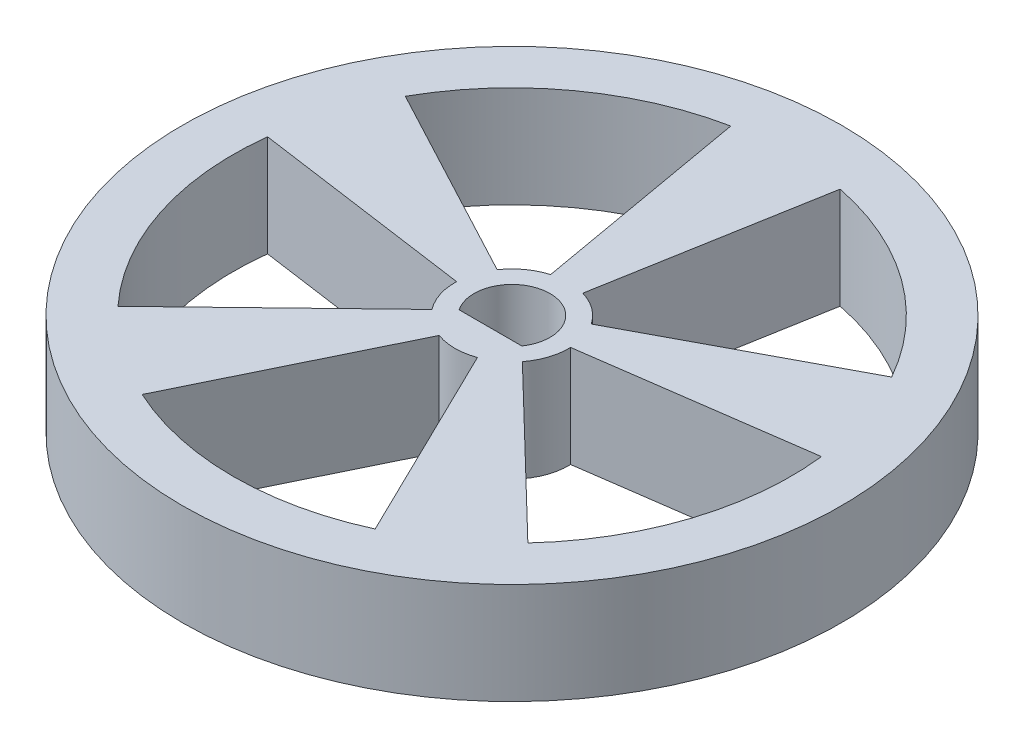
ISO-10303-21;
HEADER;
FILE_DESCRIPTION(('STEP AP214'),'2;1');
FILE_NAME('part.step','',(''),(''),'','','');
FILE_SCHEMA(('AUTOMOTIVE_DESIGN { 1 0 10303 214 1 1 1 1 }'));
ENDSEC;
DATA;
#1=APPLICATION_CONTEXT('core data for automotive mechanical design processes');
#2=APPLICATION_PROTOCOL_DEFINITION('international standard','automotive_design',2000,#1);
#3=PRODUCT_CONTEXT('',#1,'mechanical');
#4=PRODUCT('Part','Part','',(#3));
#5=PRODUCT_RELATED_PRODUCT_CATEGORY('part','',(#4));
#6=PRODUCT_DEFINITION_FORMATION('','',#4);
#7=PRODUCT_DEFINITION_CONTEXT('part definition',#1,'design');
#8=PRODUCT_DEFINITION('design','',#6,#7);
#9=PRODUCT_DEFINITION_SHAPE('','',#8);
#10=(LENGTH_UNIT() NAMED_UNIT(*) SI_UNIT(.MILLI.,.METRE.));
#11=(NAMED_UNIT(*) PLANE_ANGLE_UNIT() SI_UNIT($,.RADIAN.));
#12=(NAMED_UNIT(*) SI_UNIT($,.STERADIAN.) SOLID_ANGLE_UNIT());
#13=UNCERTAINTY_MEASURE_WITH_UNIT(LENGTH_MEASURE(1.E-05),#10,'distance_accuracy_value','');
#14=(GEOMETRIC_REPRESENTATION_CONTEXT(3) GLOBAL_UNCERTAINTY_ASSIGNED_CONTEXT((#13)) GLOBAL_UNIT_ASSIGNED_CONTEXT((#10,
#11,#12)) REPRESENTATION_CONTEXT('',''));
#15=CARTESIAN_POINT('',(0.,0.,0.));
#16=DIRECTION('',(0.,0.,1.));
#17=DIRECTION('',(1.,0.,0.));
#18=AXIS2_PLACEMENT_3D('',#15,#16,#17);
#19=CARTESIAN_POINT('',(0.,4.,0.));
#20=DIRECTION('',(0.,-1.,0.));
#21=DIRECTION('',(0.,0.,-1.));
#22=AXIS2_PLACEMENT_3D('',#19,#20,#21);
#23=CYLINDRICAL_SURFACE('',#22,1.5);
#24=CARTESIAN_POINT('',(0.,0.5,0.));
#25=DIRECTION('',(0.,1.,0.));
#26=DIRECTION('',(0.,0.,1.));
#27=AXIS2_PLACEMENT_3D('',#24,#25,#26);
#28=CIRCLE('',#27,1.5);
#29=CARTESIAN_POINT('',(1.23592070943083,0.5,0.85));
#30=VERTEX_POINT('',#29);
#31=CARTESIAN_POINT('',(-1.23592070943083,0.5,0.85));
#32=VERTEX_POINT('',#31);
#33=EDGE_CURVE('E243',#30,#32,#28,.T.);
#34=ORIENTED_EDGE('',*,*,#33,.F.);
#35=DIRECTION('',(0.,-1.,0.));
#36=VECTOR('',#35,1.);
#37=CARTESIAN_POINT('',(1.23592070943083,4.,0.85));
#38=LINE('',#37,#36);
#39=CARTESIAN_POINT('',(1.23592070943083,4.,0.85));
#40=VERTEX_POINT('',#39);
#41=EDGE_CURVE('E47',#40,#30,#38,.T.);
#42=ORIENTED_EDGE('',*,*,#41,.F.);
#43=CARTESIAN_POINT('',(0.,4.,0.));
#44=DIRECTION('',(0.,1.,0.));
#45=DIRECTION('',(0.,0.,1.));
#46=AXIS2_PLACEMENT_3D('',#43,#44,#45);
#47=CIRCLE('',#46,1.5);
#48=CARTESIAN_POINT('',(-1.23592070943083,4.,0.85));
#49=VERTEX_POINT('',#48);
#50=EDGE_CURVE('E207',#40,#49,#47,.T.);
#51=ORIENTED_EDGE('',*,*,#50,.T.);
#52=DIRECTION('',(0.,-1.,0.));
#53=VECTOR('',#52,1.);
#54=CARTESIAN_POINT('',(-1.23592070943083,4.,0.85));
#55=LINE('',#54,#53);
#56=EDGE_CURVE('E56',#49,#32,#55,.T.);
#57=ORIENTED_EDGE('',*,*,#56,.T.);
#58=EDGE_LOOP('',(#34,#42,#51,#57));
#59=FACE_BOUND('',#58,.T.);
#60=ADVANCED_FACE('F41',(#59),#23,.F.);
#61=CARTESIAN_POINT('',(0.0348666455538125,4.,0.248089074094686));
#62=DIRECTION('',(0.139173100960073,0.,0.990268068741569));
#63=DIRECTION('',(0.990268068741569,0.,-0.139173100960073));
#64=AXIS2_PLACEMENT_3D('',#61,#62,#63);
#65=PLANE('',#64);
#66=DIRECTION('',(-0.990268068741569,0.,0.139173100960073));
#67=VECTOR('',#66,1.);
#68=CARTESIAN_POINT('',(0.0348666455538125,0.,0.248089074094686));
#69=LINE('',#68,#67);
#70=CARTESIAN_POINT('',(10.9249898962605,0.,-1.28241793757164));
#71=VERTEX_POINT('',#70);
#72=CARTESIAN_POINT('',(2.24911493315821,0.,-0.0631032284836004));
#73=VERTEX_POINT('',#72);
#74=EDGE_CURVE('E276',#71,#73,#69,.T.);
#75=ORIENTED_EDGE('',*,*,#74,.F.);
#76=DIRECTION('',(0.,-1.,0.));
#77=VECTOR('',#76,1.);
#78=CARTESIAN_POINT('',(10.9249898962605,4.,-1.28241793757164));
#79=LINE('',#78,#77);
#80=CARTESIAN_POINT('',(10.9249898962605,4.,-1.28241793757164));
#81=VERTEX_POINT('',#80);
#82=EDGE_CURVE('E219',#81,#71,#79,.T.);
#83=ORIENTED_EDGE('',*,*,#82,.F.);
#84=DIRECTION('',(-0.990268068741569,0.,0.139173100960073));
#85=VECTOR('',#84,1.);
#86=CARTESIAN_POINT('',(0.0348666455538125,4.,0.248089074094686));
#87=LINE('',#86,#85);
#88=CARTESIAN_POINT('',(2.24911493315821,4.,-0.0631032284836004));
#89=VERTEX_POINT('',#88);
#90=EDGE_CURVE('E205',#81,#89,#87,.T.);
#91=ORIENTED_EDGE('',*,*,#90,.T.);
#92=DIRECTION('',(0.,-1.,0.));
#93=VECTOR('',#92,1.);
#94=CARTESIAN_POINT('',(2.24911493315821,4.,-0.0631032284836004));
#95=LINE('',#94,#93);
#96=EDGE_CURVE('E128',#89,#73,#95,.T.);
#97=ORIENTED_EDGE('',*,*,#96,.T.);
#98=EDGE_LOOP('',(#75,#83,#91,#97));
#99=FACE_BOUND('',#98,.T.);
#100=ADVANCED_FACE('F218',(#99),#65,.T.);
#101=CARTESIAN_POINT('',(0.,4.,0.));
#102=DIRECTION('',(0.,-1.,0.));
#103=DIRECTION('',(0.,0.,-1.));
#104=AXIS2_PLACEMENT_3D('',#101,#102,#103);
#105=CYLINDRICAL_SURFACE('',#104,11.);
#106=CARTESIAN_POINT('',(0.,0.,0.));
#107=DIRECTION('',(0.,1.,0.));
#108=DIRECTION('',(0.,0.,1.));
#109=AXIS2_PLACEMENT_3D('',#106,#107,#108);
#110=CIRCLE('',#109,11.);
#111=CARTESIAN_POINT('',(8.0847161384699,0.,7.45904584785242));
#112=VERTEX_POINT('',#111);
#113=EDGE_CURVE('E283',#112,#71,#110,.T.);
#114=ORIENTED_EDGE('',*,*,#113,.F.);
#115=DIRECTION('',(0.,-1.,0.));
#116=VECTOR('',#115,1.);
#117=CARTESIAN_POINT('',(8.0847161384699,4.,7.45904584785242));
#118=LINE('',#117,#116);
#119=CARTESIAN_POINT('',(8.0847161384699,4.,7.45904584785242));
#120=VERTEX_POINT('',#119);
#121=EDGE_CURVE('E294',#120,#112,#118,.T.);
#122=ORIENTED_EDGE('',*,*,#121,.F.);
#123=CARTESIAN_POINT('',(0.,4.,0.));
#124=DIRECTION('',(0.,1.,0.));
#125=DIRECTION('',(0.,0.,1.));
#126=AXIS2_PLACEMENT_3D('',#123,#124,#125);
#127=CIRCLE('',#126,11.);
#128=EDGE_CURVE('E222',#120,#81,#127,.T.);
#129=ORIENTED_EDGE('',*,*,#128,.T.);
#130=ORIENTED_EDGE('',*,*,#82,.T.);
#131=EDGE_LOOP('',(#114,#122,#129,#130));
#132=FACE_BOUND('',#131,.T.);
#133=ADVANCED_FACE('F439',(#132),#105,.F.);
#134=CARTESIAN_POINT('',(0.174030807798114,4.,-0.180214177008405));
#135=DIRECTION('',(-0.694658370459002,0.,0.719339800338647));
#136=DIRECTION('',(0.719339800338647,0.,0.694658370459002));
#137=AXIS2_PLACEMENT_3D('',#134,#135,#136);
#138=PLANE('',#137);
#139=DIRECTION('',(-0.719339800338647,0.,-0.694658370459002));
#140=VECTOR('',#139,1.);
#141=CARTESIAN_POINT('',(0.174030807798114,0.,-0.180214177008405));
#142=LINE('',#141,#140);
#143=CARTESIAN_POINT('',(1.78248105615321,0.,1.37304817266379));
#144=VERTEX_POINT('',#143);
#145=EDGE_CURVE('E285',#112,#144,#142,.T.);
#146=ORIENTED_EDGE('',*,*,#145,.T.);
#147=DIRECTION('',(0.,-1.,0.));
#148=VECTOR('',#147,1.);
#149=CARTESIAN_POINT('',(1.78248105615321,4.,1.37304817266379));
#150=LINE('',#149,#148);
#151=CARTESIAN_POINT('',(1.78248105615321,4.,1.37304817266379));
#152=VERTEX_POINT('',#151);
#153=EDGE_CURVE('E216',#152,#144,#150,.T.);
#154=ORIENTED_EDGE('',*,*,#153,.F.);
#155=DIRECTION('',(-0.719339800338647,0.,-0.694658370459002));
#156=VECTOR('',#155,1.);
#157=CARTESIAN_POINT('',(0.174030807798114,4.,-0.180214177008405));
#158=LINE('',#157,#156);
#159=EDGE_CURVE('E202',#120,#152,#158,.T.);
#160=ORIENTED_EDGE('',*,*,#159,.F.);
#161=ORIENTED_EDGE('',*,*,#121,.T.);
#162=EDGE_LOOP('',(#146,#154,#160,#161));
#163=FACE_BOUND('',#162,.T.);
#164=ADVANCED_FACE('F447',(#163),#138,.F.);
#165=CARTESIAN_POINT('',(0.246721116552598,4.,0.043503589558739));
#166=DIRECTION('',(0.984807753012209,0.,0.173648177666923));
#167=DIRECTION('',(0.173648177666923,0.,-0.984807753012209));
#168=AXIS2_PLACEMENT_3D('',#165,#166,#167);
#169=PLANE('',#168);
#170=DIRECTION('',(-0.173648177666923,0.,0.984807753012209));
#171=VECTOR('',#170,1.);
#172=CARTESIAN_POINT('',(0.246721116552598,0.,0.043503589558739));
#173=LINE('',#172,#171);
#174=CARTESIAN_POINT('',(2.15635560517804,0.,-10.7865717678981));
#175=VERTEX_POINT('',#174);
#176=CARTESIAN_POINT('',(0.635,0.,-2.15853538307807));
#177=VERTEX_POINT('',#176);
#178=EDGE_CURVE('E267',#175,#177,#173,.T.);
#179=ORIENTED_EDGE('',*,*,#178,.F.);
#180=DIRECTION('',(0.,-1.,0.));
#181=VECTOR('',#180,1.);
#182=CARTESIAN_POINT('',(2.15635560517804,4.,-10.7865717678981));
#183=LINE('',#182,#181);
#184=CARTESIAN_POINT('',(2.15635560517804,4.,-10.7865717678981));
#185=VERTEX_POINT('',#184);
#186=EDGE_CURVE('E220',#185,#175,#183,.T.);
#187=ORIENTED_EDGE('',*,*,#186,.F.);
#188=DIRECTION('',(-0.173648177666923,0.,0.984807753012209));
#189=VECTOR('',#188,1.);
#190=CARTESIAN_POINT('',(0.246721116552598,4.,0.043503589558739));
#191=LINE('',#190,#189);
#192=CARTESIAN_POINT('',(0.635,4.,-2.15853538307807));
#193=VERTEX_POINT('',#192);
#194=EDGE_CURVE('E365',#185,#193,#191,.T.);
#195=ORIENTED_EDGE('',*,*,#194,.T.);
#196=DIRECTION('',(0.,-1.,0.));
#197=VECTOR('',#196,1.);
#198=CARTESIAN_POINT('',(0.635,4.,-2.15853538307807));
#199=LINE('',#198,#197);
#200=EDGE_CURVE('E299',#193,#177,#199,.T.);
#201=ORIENTED_EDGE('',*,*,#200,.T.);
#202=EDGE_LOOP('',(#179,#187,#195,#201));
#203=FACE_BOUND('',#202,.T.);
#204=ADVANCED_FACE('F397',(#203),#169,.T.);
#205=CARTESIAN_POINT('',(0.,4.,0.));
#206=DIRECTION('',(0.,-1.,0.));
#207=DIRECTION('',(0.,0.,-1.));
#208=AXIS2_PLACEMENT_3D('',#205,#206,#207);
#209=CYLINDRICAL_SURFACE('',#208,11.);
#210=CARTESIAN_POINT('',(0.,0.,0.));
#211=DIRECTION('',(0.,1.,0.));
#212=DIRECTION('',(0.,0.,1.));
#213=AXIS2_PLACEMENT_3D('',#210,#211,#212);
#214=CIRCLE('',#213,11.);
#215=CARTESIAN_POINT('',(9.59228884042909,0.,-5.38405003707985));
#216=VERTEX_POINT('',#215);
#217=EDGE_CURVE('E275',#216,#175,#214,.T.);
#218=ORIENTED_EDGE('',*,*,#217,.F.);
#219=DIRECTION('',(0.,-1.,0.));
#220=VECTOR('',#219,1.);
#221=CARTESIAN_POINT('',(9.59228884042909,4.,-5.38405003707985));
#222=LINE('',#221,#220);
#223=CARTESIAN_POINT('',(9.59228884042909,4.,-5.38405003707985));
#224=VERTEX_POINT('',#223);
#225=EDGE_CURVE('E302',#224,#216,#222,.T.);
#226=ORIENTED_EDGE('',*,*,#225,.F.);
#227=CARTESIAN_POINT('',(0.,4.,0.));
#228=DIRECTION('',(0.,1.,0.));
#229=DIRECTION('',(0.,0.,1.));
#230=AXIS2_PLACEMENT_3D('',#227,#228,#229);
#231=CIRCLE('',#230,11.);
#232=EDGE_CURVE('E371',#224,#185,#231,.T.);
#233=ORIENTED_EDGE('',*,*,#232,.T.);
#234=ORIENTED_EDGE('',*,*,#186,.T.);
#235=EDGE_LOOP('',(#218,#226,#233,#234));
#236=FACE_BOUND('',#235,.T.);
#237=ADVANCED_FACE('F396',(#236),#209,.F.);
#238=CARTESIAN_POINT('',(-0.117615390218064,4.,-0.221202377115152));
#239=DIRECTION('',(0.469471562785885,0.,0.88294759285893));
#240=DIRECTION('',(0.88294759285893,0.,-0.469471562785885));
#241=AXIS2_PLACEMENT_3D('',#238,#239,#240);
#242=PLANE('',#241);
#243=DIRECTION('',(-0.88294759285893,0.,0.469471562785885));
#244=VECTOR('',#243,1.);
#245=CARTESIAN_POINT('',(-0.117615390218064,0.,-0.221202377115152));
#246=LINE('',#245,#244);
#247=CARTESIAN_POINT('',(1.85666335030199,0.,-1.27094500417838));
#248=VERTEX_POINT('',#247);
#249=EDGE_CURVE('E274',#216,#248,#246,.T.);
#250=ORIENTED_EDGE('',*,*,#249,.T.);
#251=DIRECTION('',(0.,-1.,0.));
#252=VECTOR('',#251,1.);
#253=CARTESIAN_POINT('',(1.85666335030199,4.,-1.27094500417838));
#254=LINE('',#253,#252);
#255=CARTESIAN_POINT('',(1.85666335030199,4.,-1.27094500417838));
#256=VERTEX_POINT('',#255);
#257=EDGE_CURVE('E300',#256,#248,#254,.T.);
#258=ORIENTED_EDGE('',*,*,#257,.F.);
#259=DIRECTION('',(-0.88294759285893,0.,0.469471562785885));
#260=VECTOR('',#259,1.);
#261=CARTESIAN_POINT('',(-0.117615390218064,4.,-0.221202377115152));
#262=LINE('',#261,#260);
#263=EDGE_CURVE('E221',#224,#256,#262,.T.);
#264=ORIENTED_EDGE('',*,*,#263,.F.);
#265=ORIENTED_EDGE('',*,*,#225,.T.);
#266=EDGE_LOOP('',(#250,#258,#264,#265));
#267=FACE_BOUND('',#266,.T.);
#268=ADVANCED_FACE('F393',(#267),#242,.F.);
#269=CARTESIAN_POINT('',(0.117615390217946,4.,-0.22120237711493));
#270=DIRECTION('',(0.469471562785884,0.,-0.88294759285893));
#271=DIRECTION('',(-0.88294759285893,0.,-0.469471562785884));
#272=AXIS2_PLACEMENT_3D('',#269,#270,#271);
#273=PLANE('',#272);
#274=DIRECTION('',(0.88294759285893,0.,0.469471562785884));
#275=VECTOR('',#274,1.);
#276=CARTESIAN_POINT('',(0.117615390217946,0.,-0.22120237711493));
#277=LINE('',#276,#275);
#278=CARTESIAN_POINT('',(-9.59228884042921,0.,-5.38405003707963));
#279=VERTEX_POINT('',#278);
#280=CARTESIAN_POINT('',(-1.85666335030187,0.,-1.27094500417806));
#281=VERTEX_POINT('',#280);
#282=EDGE_CURVE('E259',#279,#281,#277,.T.);
#283=ORIENTED_EDGE('',*,*,#282,.F.);
#284=DIRECTION('',(0.,-1.,0.));
#285=VECTOR('',#284,1.);
#286=CARTESIAN_POINT('',(-9.59228884042921,4.,-5.38405003707963));
#287=LINE('',#286,#285);
#288=CARTESIAN_POINT('',(-9.59228884042921,4.,-5.38405003707963));
#289=VERTEX_POINT('',#288);
#290=EDGE_CURVE('E296',#289,#279,#287,.T.);
#291=ORIENTED_EDGE('',*,*,#290,.F.);
#292=DIRECTION('',(0.88294759285893,0.,0.469471562785884));
#293=VECTOR('',#292,1.);
#294=CARTESIAN_POINT('',(0.117615390217946,4.,-0.22120237711493));
#295=LINE('',#294,#293);
#296=CARTESIAN_POINT('',(-1.85666335030187,4.,-1.27094500417806));
#297=VERTEX_POINT('',#296);
#298=EDGE_CURVE('E363',#289,#297,#295,.T.);
#299=ORIENTED_EDGE('',*,*,#298,.T.);
#300=DIRECTION('',(0.,-1.,0.));
#301=VECTOR('',#300,1.);
#302=CARTESIAN_POINT('',(-1.85666335030187,4.,-1.27094500417806));
#303=LINE('',#302,#301);
#304=EDGE_CURVE('E308',#297,#281,#303,.T.);
#305=ORIENTED_EDGE('',*,*,#304,.T.);
#306=EDGE_LOOP('',(#283,#291,#299,#305));
#307=FACE_BOUND('',#306,.T.);
#308=ADVANCED_FACE('F460',(#307),#273,.T.);
#309=CARTESIAN_POINT('',(0.,4.,0.));
#310=DIRECTION('',(0.,-1.,0.));
#311=DIRECTION('',(0.,0.,-1.));
#312=AXIS2_PLACEMENT_3D('',#309,#310,#311);
#313=CYLINDRICAL_SURFACE('',#312,11.);
#314=CARTESIAN_POINT('',(0.,0.,0.));
#315=DIRECTION('',(0.,1.,0.));
#316=DIRECTION('',(0.,0.,1.));
#317=AXIS2_PLACEMENT_3D('',#314,#315,#316);
#318=CIRCLE('',#317,11.);
#319=CARTESIAN_POINT('',(-2.15635560517804,0.,-10.7865717678981));
#320=VERTEX_POINT('',#319);
#321=EDGE_CURVE('E265',#320,#279,#318,.T.);
#322=ORIENTED_EDGE('',*,*,#321,.F.);
#323=DIRECTION('',(0.,-1.,0.));
#324=VECTOR('',#323,1.);
#325=CARTESIAN_POINT('',(-2.15635560517804,4.,-10.7865717678981));
#326=LINE('',#325,#324);
#327=CARTESIAN_POINT('',(-2.15635560517804,4.,-10.7865717678981));
#328=VERTEX_POINT('',#327);
#329=EDGE_CURVE('E315',#328,#320,#326,.T.);
#330=ORIENTED_EDGE('',*,*,#329,.F.);
#331=CARTESIAN_POINT('',(0.,4.,0.));
#332=DIRECTION('',(0.,1.,0.));
#333=DIRECTION('',(0.,0.,1.));
#334=AXIS2_PLACEMENT_3D('',#331,#332,#333);
#335=CIRCLE('',#334,11.);
#336=EDGE_CURVE('E373',#328,#289,#335,.T.);
#337=ORIENTED_EDGE('',*,*,#336,.T.);
#338=ORIENTED_EDGE('',*,*,#290,.T.);
#339=EDGE_LOOP('',(#322,#330,#337,#338));
#340=FACE_BOUND('',#339,.T.);
#341=ADVANCED_FACE('F465',(#340),#313,.F.);
#342=CARTESIAN_POINT('',(-0.246721116552596,4.,0.0435035895587388));
#343=DIRECTION('',(0.984807753012209,0.,-0.173648177666924));
#344=DIRECTION('',(-0.173648177666924,0.,-0.984807753012209));
#345=AXIS2_PLACEMENT_3D('',#342,#343,#344);
#346=PLANE('',#345);
#347=DIRECTION('',(0.173648177666924,0.,0.984807753012209));
#348=VECTOR('',#347,1.);
#349=CARTESIAN_POINT('',(-0.246721116552596,0.,0.0435035895587388));
#350=LINE('',#349,#348);
#351=CARTESIAN_POINT('',(-0.635,0.,-2.15853538307807));
#352=VERTEX_POINT('',#351);
#353=EDGE_CURVE('E264',#320,#352,#350,.T.);
#354=ORIENTED_EDGE('',*,*,#353,.T.);
#355=DIRECTION('',(0.,-1.,0.));
#356=VECTOR('',#355,1.);
#357=CARTESIAN_POINT('',(-0.635,4.,-2.15853538307807));
#358=LINE('',#357,#356);
#359=CARTESIAN_POINT('',(-0.635,4.,-2.15853538307807));
#360=VERTEX_POINT('',#359);
#361=EDGE_CURVE('E306',#360,#352,#358,.T.);
#362=ORIENTED_EDGE('',*,*,#361,.F.);
#363=DIRECTION('',(0.173648177666924,0.,0.984807753012209));
#364=VECTOR('',#363,1.);
#365=CARTESIAN_POINT('',(-0.246721116552596,4.,0.0435035895587388));
#366=LINE('',#365,#364);
#367=EDGE_CURVE('E364',#328,#360,#366,.T.);
#368=ORIENTED_EDGE('',*,*,#367,.F.);
#369=ORIENTED_EDGE('',*,*,#329,.T.);
#370=EDGE_LOOP('',(#354,#362,#368,#369));
#371=FACE_BOUND('',#370,.T.);
#372=ADVANCED_FACE('F427',(#371),#346,.F.);
#373=CARTESIAN_POINT('',(0.,4.,0.));
#374=DIRECTION('',(0.,-1.,0.));
#375=DIRECTION('',(0.,0.,-1.));
#376=AXIS2_PLACEMENT_3D('',#373,#374,#375);
#377=CYLINDRICAL_SURFACE('',#376,11.);
#378=CARTESIAN_POINT('',(0.,0.,0.));
#379=DIRECTION('',(0.,1.,0.));
#380=DIRECTION('',(0.,0.,1.));
#381=AXIS2_PLACEMENT_3D('',#378,#379,#380);
#382=CIRCLE('',#381,11.);
#383=CARTESIAN_POINT('',(-4.59565947745975,0.,9.99399389469667));
#384=VERTEX_POINT('',#383);
#385=CARTESIAN_POINT('',(4.5956594774606,0.,9.99399389469628));
#386=VERTEX_POINT('',#385);
#387=EDGE_CURVE('E250',#384,#386,#382,.T.);
#388=ORIENTED_EDGE('',*,*,#387,.F.);
#389=DIRECTION('',(0.,-1.,0.));
#390=VECTOR('',#389,1.);
#391=CARTESIAN_POINT('',(-4.59565947745975,4.,9.99399389469667));
#392=LINE('',#391,#390);
#393=CARTESIAN_POINT('',(-4.59565947745975,4.,9.99399389469667));
#394=VERTEX_POINT('',#393);
#395=EDGE_CURVE('E310',#394,#384,#392,.T.);
#396=ORIENTED_EDGE('',*,*,#395,.F.);
#397=CARTESIAN_POINT('',(0.,4.,0.));
#398=DIRECTION('',(0.,1.,0.));
#399=DIRECTION('',(0.,0.,1.));
#400=AXIS2_PLACEMENT_3D('',#397,#398,#399);
#401=CIRCLE('',#400,11.);
#402=CARTESIAN_POINT('',(4.5956594774606,4.,9.99399389469628));
#403=VERTEX_POINT('',#402);
#404=EDGE_CURVE('E346',#394,#403,#401,.T.);
#405=ORIENTED_EDGE('',*,*,#404,.T.);
#406=DIRECTION('',(0.,-1.,0.));
#407=VECTOR('',#406,1.);
#408=CARTESIAN_POINT('',(4.5956594774606,4.,9.99399389469628));
#409=LINE('',#408,#407);
#410=EDGE_CURVE('E312',#403,#386,#409,.T.);
#411=ORIENTED_EDGE('',*,*,#410,.T.);
#412=EDGE_LOOP('',(#388,#396,#405,#411));
#413=FACE_BOUND('',#412,.T.);
#414=ADVANCED_FACE('F416',(#413),#377,.F.);
#415=CARTESIAN_POINT('',(0.22517234452703,4.,0.109823890469614));
#416=DIRECTION('',(-0.898794046299164,0.,-0.438371146789083));
#417=DIRECTION('',(-0.438371146789083,0.,0.898794046299164));
#418=AXIS2_PLACEMENT_3D('',#415,#416,#417);
#419=PLANE('',#418);
#420=DIRECTION('',(0.438371146789083,0.,-0.898794046299164));
#421=VECTOR('',#420,1.);
#422=CARTESIAN_POINT('',(0.22517234452703,0.,0.109823890469614));
#423=LINE('',#422,#421);
#424=CARTESIAN_POINT('',(-0.755029473296228,0.,2.11953544307563));
#425=VERTEX_POINT('',#424);
#426=EDGE_CURVE('E251',#384,#425,#423,.T.);
#427=ORIENTED_EDGE('',*,*,#426,.T.);
#428=DIRECTION('',(0.,-1.,0.));
#429=VECTOR('',#428,1.);
#430=CARTESIAN_POINT('',(-0.755029473296228,4.,2.11953544307563));
#431=LINE('',#430,#429);
#432=CARTESIAN_POINT('',(-0.755029473296228,4.,2.11953544307563));
#433=VERTEX_POINT('',#432);
#434=EDGE_CURVE('E317',#433,#425,#431,.T.);
#435=ORIENTED_EDGE('',*,*,#434,.F.);
#436=DIRECTION('',(0.438371146789083,0.,-0.898794046299164));
#437=VECTOR('',#436,1.);
#438=CARTESIAN_POINT('',(0.22517234452703,4.,0.109823890469614));
#439=LINE('',#438,#437);
#440=EDGE_CURVE('E354',#394,#433,#439,.T.);
#441=ORIENTED_EDGE('',*,*,#440,.F.);
#442=ORIENTED_EDGE('',*,*,#395,.T.);
#443=EDGE_LOOP('',(#427,#435,#441,#442));
#444=FACE_BOUND('',#443,.T.);
#445=ADVANCED_FACE('F419',(#444),#419,.F.);
#446=CARTESIAN_POINT('',(0.,4.,0.));
#447=DIRECTION('',(0.,-1.,0.));
#448=DIRECTION('',(0.,0.,-1.));
#449=AXIS2_PLACEMENT_3D('',#446,#447,#448);
#450=CYLINDRICAL_SURFACE('',#449,2.25);
#451=CARTESIAN_POINT('',(0.,0.,0.));
#452=DIRECTION('',(0.,1.,0.));
#453=DIRECTION('',(0.,0.,1.));
#454=AXIS2_PLACEMENT_3D('',#451,#452,#453);
#455=CIRCLE('',#454,2.25);
#456=CARTESIAN_POINT('',(0.755029473297113,0.,2.11953544307533));
#457=VERTEX_POINT('',#456);
#458=EDGE_CURVE('E246',#425,#457,#455,.T.);
#459=ORIENTED_EDGE('',*,*,#458,.T.);
#460=DIRECTION('',(0.,-1.,0.));
#461=VECTOR('',#460,1.);
#462=CARTESIAN_POINT('',(0.755029473297113,4.,2.11953544307533));
#463=LINE('',#462,#461);
#464=CARTESIAN_POINT('',(0.755029473297113,4.,2.11953544307533));
#465=VERTEX_POINT('',#464);
#466=EDGE_CURVE('E320',#465,#457,#463,.T.);
#467=ORIENTED_EDGE('',*,*,#466,.F.);
#468=CARTESIAN_POINT('',(0.,4.,0.));
#469=DIRECTION('',(0.,1.,0.));
#470=DIRECTION('',(0.,0.,1.));
#471=AXIS2_PLACEMENT_3D('',#468,#469,#470);
#472=CIRCLE('',#471,2.25);
#473=EDGE_CURVE('E348',#433,#465,#472,.T.);
#474=ORIENTED_EDGE('',*,*,#473,.F.);
#475=ORIENTED_EDGE('',*,*,#434,.T.);
#476=EDGE_LOOP('',(#459,#467,#474,#475));
#477=FACE_BOUND('',#476,.T.);
#478=ADVANCED_FACE('F409',(#477),#450,.T.);
#479=CARTESIAN_POINT('',(-0.174030807797544,4.,-0.180214177007814));
#480=DIRECTION('',(-0.694658370459003,0.,-0.719339800338646));
#481=DIRECTION('',(-0.719339800338646,0.,0.694658370459003));
#482=AXIS2_PLACEMENT_3D('',#479,#480,#481);
#483=PLANE('',#482);
#484=DIRECTION('',(0.719339800338646,0.,-0.694658370459003));
#485=VECTOR('',#484,1.);
#486=CARTESIAN_POINT('',(-0.174030807797544,0.,-0.180214177007814));
#487=LINE('',#486,#485);
#488=CARTESIAN_POINT('',(-8.08471613846933,0.,7.45904584785303));
#489=VERTEX_POINT('',#488);
#490=CARTESIAN_POINT('',(-1.78248105615253,0.,1.37304817266424));
#491=VERTEX_POINT('',#490);
#492=EDGE_CURVE('E240',#489,#491,#487,.T.);
#493=ORIENTED_EDGE('',*,*,#492,.F.);
#494=DIRECTION('',(0.,-1.,0.));
#495=VECTOR('',#494,1.);
#496=CARTESIAN_POINT('',(-8.08471613846933,4.,7.45904584785303));
#497=LINE('',#496,#495);
#498=CARTESIAN_POINT('',(-8.08471613846933,4.,7.45904584785303));
#499=VERTEX_POINT('',#498);
#500=EDGE_CURVE('E137',#499,#489,#497,.T.);
#501=ORIENTED_EDGE('',*,*,#500,.F.);
#502=DIRECTION('',(0.719339800338646,0.,-0.694658370459003));
#503=VECTOR('',#502,1.);
#504=CARTESIAN_POINT('',(-0.174030807797544,4.,-0.180214177007814));
#505=LINE('',#504,#503);
#506=CARTESIAN_POINT('',(-1.78248105615253,4.,1.37304817266424));
#507=VERTEX_POINT('',#506);
#508=EDGE_CURVE('E286',#499,#507,#505,.T.);
#509=ORIENTED_EDGE('',*,*,#508,.T.);
#510=DIRECTION('',(0.,-1.,0.));
#511=VECTOR('',#510,1.);
#512=CARTESIAN_POINT('',(-1.78248105615253,4.,1.37304817266424));
#513=LINE('',#512,#511);
#514=EDGE_CURVE('E237',#507,#491,#513,.T.);
#515=ORIENTED_EDGE('',*,*,#514,.T.);
#516=EDGE_LOOP('',(#493,#501,#509,#515));
#517=FACE_BOUND('',#516,.T.);
#518=ADVANCED_FACE('F43',(#517),#483,.T.);
#519=CARTESIAN_POINT('',(0.,4.,0.));
#520=DIRECTION('',(0.,-1.,0.));
#521=DIRECTION('',(0.,0.,-1.));
#522=AXIS2_PLACEMENT_3D('',#519,#520,#521);
#523=CYLINDRICAL_SURFACE('',#522,11.);
#524=CARTESIAN_POINT('',(0.,0.,0.));
#525=DIRECTION('',(0.,1.,0.));
#526=DIRECTION('',(0.,0.,1.));
#527=AXIS2_PLACEMENT_3D('',#524,#525,#526);
#528=CIRCLE('',#527,11.);
#529=CARTESIAN_POINT('',(-10.9249898962606,0.,-1.28241793757122));
#530=VERTEX_POINT('',#529);
#531=EDGE_CURVE('E238',#530,#489,#528,.T.);
#532=ORIENTED_EDGE('',*,*,#531,.F.);
#533=DIRECTION('',(0.,-1.,0.));
#534=VECTOR('',#533,1.);
#535=CARTESIAN_POINT('',(-10.9249898962606,4.,-1.28241793757122));
#536=LINE('',#535,#534);
#537=CARTESIAN_POINT('',(-10.9249898962606,4.,-1.28241793757122));
#538=VERTEX_POINT('',#537);
#539=EDGE_CURVE('E330',#538,#530,#536,.T.);
#540=ORIENTED_EDGE('',*,*,#539,.F.);
#541=CARTESIAN_POINT('',(0.,4.,0.));
#542=DIRECTION('',(0.,1.,0.));
#543=DIRECTION('',(0.,0.,1.));
#544=AXIS2_PLACEMENT_3D('',#541,#542,#543);
#545=CIRCLE('',#544,11.);
#546=EDGE_CURVE('E334',#538,#499,#545,.T.);
#547=ORIENTED_EDGE('',*,*,#546,.T.);
#548=ORIENTED_EDGE('',*,*,#500,.T.);
#549=EDGE_LOOP('',(#532,#540,#547,#548));
#550=FACE_BOUND('',#549,.T.);
#551=ADVANCED_FACE('F332',(#550),#523,.F.);
#552=CARTESIAN_POINT('',(-0.0348666455538699,4.,0.248089074095096));
#553=DIRECTION('',(0.139173100960072,0.,-0.990268068741569));
#554=DIRECTION('',(-0.99026806874157,0.,-0.139173100960072));
#555=AXIS2_PLACEMENT_3D('',#552,#553,#554);
#556=PLANE('',#555);
#557=DIRECTION('',(0.990268068741569,0.,0.139173100960072));
#558=VECTOR('',#557,1.);
#559=CARTESIAN_POINT('',(-0.0348666455538699,0.,0.248089074095096));
#560=LINE('',#559,#558);
#561=CARTESIAN_POINT('',(-2.24911493315804,0.,-0.0631032284831385));
#562=VERTEX_POINT('',#561);
#563=EDGE_CURVE('E245',#530,#562,#560,.T.);
#564=ORIENTED_EDGE('',*,*,#563,.T.);
#565=DIRECTION('',(0.,-1.,0.));
#566=VECTOR('',#565,1.);
#567=CARTESIAN_POINT('',(-2.24911493315804,4.,-0.0631032284831385));
#568=LINE('',#567,#566);
#569=CARTESIAN_POINT('',(-2.24911493315804,4.,-0.0631032284831385));
#570=VERTEX_POINT('',#569);
#571=EDGE_CURVE('E322',#570,#562,#568,.T.);
#572=ORIENTED_EDGE('',*,*,#571,.F.);
#573=DIRECTION('',(0.990268068741569,0.,0.139173100960072));
#574=VECTOR('',#573,1.);
#575=CARTESIAN_POINT('',(-0.0348666455538699,4.,0.248089074095096));
#576=LINE('',#575,#574);
#577=EDGE_CURVE('E349',#538,#570,#576,.T.);
#578=ORIENTED_EDGE('',*,*,#577,.F.);
#579=ORIENTED_EDGE('',*,*,#539,.T.);
#580=EDGE_LOOP('',(#564,#572,#578,#579));
#581=FACE_BOUND('',#580,.T.);
#582=ADVANCED_FACE('F344',(#581),#556,.F.);
#583=CARTESIAN_POINT('',(0.,4.,0.85));
#584=DIRECTION('',(0.,0.,-1.));
#585=DIRECTION('',(-1.,0.,0.));
#586=AXIS2_PLACEMENT_3D('',#583,#584,#585);
#587=PLANE('',#586);
#588=DIRECTION('',(1.,0.,0.));
#589=VECTOR('',#588,1.);
#590=CARTESIAN_POINT('',(0.,0.5,0.85));
#591=LINE('',#590,#589);
#592=EDGE_CURVE('E11',#32,#30,#591,.T.);
#593=ORIENTED_EDGE('',*,*,#592,.F.);
#594=ORIENTED_EDGE('',*,*,#56,.F.);
#595=DIRECTION('',(1.,0.,0.));
#596=VECTOR('',#595,1.);
#597=CARTESIAN_POINT('',(0.,4.,0.85));
#598=LINE('',#597,#596);
#599=EDGE_CURVE('E233',#49,#40,#598,.T.);
#600=ORIENTED_EDGE('',*,*,#599,.T.);
#601=ORIENTED_EDGE('',*,*,#41,.T.);
#602=EDGE_LOOP('',(#593,#594,#600,#601));
#603=FACE_BOUND('',#602,.T.);
#604=ADVANCED_FACE('F441',(#603),#587,.T.);
#605=EDGE_CURVE('E212',#144,#73,#455,.T.);
#606=ORIENTED_EDGE('',*,*,#605,.T.);
#607=ORIENTED_EDGE('',*,*,#96,.F.);
#608=EDGE_CURVE('E196',#152,#89,#472,.T.);
#609=ORIENTED_EDGE('',*,*,#608,.F.);
#610=ORIENTED_EDGE('',*,*,#153,.T.);
#611=EDGE_LOOP('',(#606,#607,#609,#610));
#612=FACE_BOUND('',#611,.T.);
#613=ADVANCED_FACE('F213',(#612),#450,.T.);
#614=EDGE_CURVE('E279',#248,#177,#455,.T.);
#615=ORIENTED_EDGE('',*,*,#614,.T.);
#616=ORIENTED_EDGE('',*,*,#200,.F.);
#617=EDGE_CURVE('E211',#256,#193,#472,.T.);
#618=ORIENTED_EDGE('',*,*,#617,.F.);
#619=ORIENTED_EDGE('',*,*,#257,.T.);
#620=EDGE_LOOP('',(#615,#616,#618,#619));
#621=FACE_BOUND('',#620,.T.);
#622=ADVANCED_FACE('F391',(#621),#450,.T.);
#623=EDGE_CURVE('E268',#352,#281,#455,.T.);
#624=ORIENTED_EDGE('',*,*,#623,.T.);
#625=ORIENTED_EDGE('',*,*,#304,.F.);
#626=EDGE_CURVE('E223',#360,#297,#472,.T.);
#627=ORIENTED_EDGE('',*,*,#626,.F.);
#628=ORIENTED_EDGE('',*,*,#361,.T.);
#629=EDGE_LOOP('',(#624,#625,#627,#628));
#630=FACE_BOUND('',#629,.T.);
#631=ADVANCED_FACE('F428',(#630),#450,.T.);
#632=CARTESIAN_POINT('',(-0.225172344526199,4.,0.109823890469209));
#633=DIRECTION('',(-0.898794046299164,0.,0.438371146789084));
#634=DIRECTION('',(0.438371146789084,0.,0.898794046299164));
#635=AXIS2_PLACEMENT_3D('',#632,#633,#634);
#636=PLANE('',#635);
#637=DIRECTION('',(-0.438371146789084,0.,-0.898794046299164));
#638=VECTOR('',#637,1.);
#639=CARTESIAN_POINT('',(-0.225172344526199,0.,0.109823890469209));
#640=LINE('',#639,#638);
#641=EDGE_CURVE('E258',#386,#457,#640,.T.);
#642=ORIENTED_EDGE('',*,*,#641,.F.);
#643=ORIENTED_EDGE('',*,*,#410,.F.);
#644=DIRECTION('',(-0.438371146789084,0.,-0.898794046299164));
#645=VECTOR('',#644,1.);
#646=CARTESIAN_POINT('',(-0.225172344526199,4.,0.109823890469209));
#647=LINE('',#646,#645);
#648=EDGE_CURVE('E351',#403,#465,#647,.T.);
#649=ORIENTED_EDGE('',*,*,#648,.T.);
#650=ORIENTED_EDGE('',*,*,#466,.T.);
#651=EDGE_LOOP('',(#642,#643,#649,#650));
#652=FACE_BOUND('',#651,.T.);
#653=ADVANCED_FACE('F415',(#652),#636,.T.);
#654=EDGE_CURVE('E248',#562,#491,#455,.T.);
#655=ORIENTED_EDGE('',*,*,#654,.T.);
#656=ORIENTED_EDGE('',*,*,#514,.F.);
#657=EDGE_CURVE('E215',#570,#507,#472,.T.);
#658=ORIENTED_EDGE('',*,*,#657,.F.);
#659=ORIENTED_EDGE('',*,*,#571,.T.);
#660=EDGE_LOOP('',(#655,#656,#658,#659));
#661=FACE_BOUND('',#660,.T.);
#662=ADVANCED_FACE('F347',(#661),#450,.T.);
#663=CARTESIAN_POINT('',(0.,4.,0.));
#664=DIRECTION('',(0.,-1.,0.));
#665=DIRECTION('',(0.,0.,-1.));
#666=AXIS2_PLACEMENT_3D('',#663,#664,#665);
#667=CYLINDRICAL_SURFACE('',#666,13.);
#668=CARTESIAN_POINT('',(0.,4.,0.));
#669=DIRECTION('',(0.,1.,0.));
#670=DIRECTION('',(0.,0.,1.));
#671=AXIS2_PLACEMENT_3D('',#668,#669,#670);
#672=CIRCLE('',#671,13.);
#673=CARTESIAN_POINT('',(0.,4.,13.));
#674=VERTEX_POINT('',#673);
#675=EDGE_CURVE('E232',#674,#674,#672,.T.);
#676=ORIENTED_EDGE('',*,*,#675,.F.);
#677=EDGE_LOOP('',(#676));
#678=FACE_BOUND('',#677,.T.);
#679=CARTESIAN_POINT('',(0.,0.,0.));
#680=DIRECTION('',(0.,1.,0.));
#681=DIRECTION('',(0.,0.,1.));
#682=AXIS2_PLACEMENT_3D('',#679,#680,#681);
#683=CIRCLE('',#682,13.);
#684=CARTESIAN_POINT('',(0.,0.,13.));
#685=VERTEX_POINT('',#684);
#686=EDGE_CURVE('E289',#685,#685,#683,.T.);
#687=ORIENTED_EDGE('',*,*,#686,.T.);
#688=EDGE_LOOP('',(#687));
#689=FACE_BOUND('',#688,.T.);
#690=ADVANCED_FACE('F478',(#678,#689),#667,.T.);
#691=CARTESIAN_POINT('',(0.,4.,0.));
#692=DIRECTION('',(0.,1.,0.));
#693=DIRECTION('',(0.,0.,1.));
#694=AXIS2_PLACEMENT_3D('',#691,#692,#693);
#695=PLANE('',#694);
#696=ORIENTED_EDGE('',*,*,#508,.F.);
#697=ORIENTED_EDGE('',*,*,#546,.F.);
#698=ORIENTED_EDGE('',*,*,#577,.T.);
#699=ORIENTED_EDGE('',*,*,#657,.T.);
#700=EDGE_LOOP('',(#696,#697,#698,#699));
#701=FACE_BOUND('',#700,.T.);
#702=ORIENTED_EDGE('',*,*,#404,.F.);
#703=ORIENTED_EDGE('',*,*,#440,.T.);
#704=ORIENTED_EDGE('',*,*,#473,.T.);
#705=ORIENTED_EDGE('',*,*,#648,.F.);
#706=EDGE_LOOP('',(#702,#703,#704,#705));
#707=FACE_BOUND('',#706,.T.);
#708=ORIENTED_EDGE('',*,*,#298,.F.);
#709=ORIENTED_EDGE('',*,*,#336,.F.);
#710=ORIENTED_EDGE('',*,*,#367,.T.);
#711=ORIENTED_EDGE('',*,*,#626,.T.);
#712=EDGE_LOOP('',(#708,#709,#710,#711));
#713=FACE_BOUND('',#712,.T.);
#714=ORIENTED_EDGE('',*,*,#194,.F.);
#715=ORIENTED_EDGE('',*,*,#232,.F.);
#716=ORIENTED_EDGE('',*,*,#263,.T.);
#717=ORIENTED_EDGE('',*,*,#617,.T.);
#718=EDGE_LOOP('',(#714,#715,#716,#717));
#719=FACE_BOUND('',#718,.T.);
#720=ORIENTED_EDGE('',*,*,#90,.F.);
#721=ORIENTED_EDGE('',*,*,#128,.F.);
#722=ORIENTED_EDGE('',*,*,#159,.T.);
#723=ORIENTED_EDGE('',*,*,#608,.T.);
#724=EDGE_LOOP('',(#720,#721,#722,#723));
#725=FACE_BOUND('',#724,.T.);
#726=ORIENTED_EDGE('',*,*,#50,.F.);
#727=ORIENTED_EDGE('',*,*,#599,.F.);
#728=EDGE_LOOP('',(#726,#727));
#729=FACE_BOUND('',#728,.T.);
#730=ORIENTED_EDGE('',*,*,#675,.T.);
#731=EDGE_LOOP('',(#730));
#732=FACE_BOUND('',#731,.T.);
#733=ADVANCED_FACE('F200',(#701,#707,#713,#719,#725,#729,#732),#695,.T.);
#734=CARTESIAN_POINT('',(0.,0.,0.));
#735=DIRECTION('',(0.,1.,0.));
#736=DIRECTION('',(0.,0.,1.));
#737=AXIS2_PLACEMENT_3D('',#734,#735,#736);
#738=PLANE('',#737);
#739=ORIENTED_EDGE('',*,*,#492,.T.);
#740=ORIENTED_EDGE('',*,*,#654,.F.);
#741=ORIENTED_EDGE('',*,*,#563,.F.);
#742=ORIENTED_EDGE('',*,*,#531,.T.);
#743=EDGE_LOOP('',(#739,#740,#741,#742));
#744=FACE_BOUND('',#743,.T.);
#745=ORIENTED_EDGE('',*,*,#387,.T.);
#746=ORIENTED_EDGE('',*,*,#641,.T.);
#747=ORIENTED_EDGE('',*,*,#458,.F.);
#748=ORIENTED_EDGE('',*,*,#426,.F.);
#749=EDGE_LOOP('',(#745,#746,#747,#748));
#750=FACE_BOUND('',#749,.T.);
#751=ORIENTED_EDGE('',*,*,#282,.T.);
#752=ORIENTED_EDGE('',*,*,#623,.F.);
#753=ORIENTED_EDGE('',*,*,#353,.F.);
#754=ORIENTED_EDGE('',*,*,#321,.T.);
#755=EDGE_LOOP('',(#751,#752,#753,#754));
#756=FACE_BOUND('',#755,.T.);
#757=ORIENTED_EDGE('',*,*,#178,.T.);
#758=ORIENTED_EDGE('',*,*,#614,.F.);
#759=ORIENTED_EDGE('',*,*,#249,.F.);
#760=ORIENTED_EDGE('',*,*,#217,.T.);
#761=EDGE_LOOP('',(#757,#758,#759,#760));
#762=FACE_BOUND('',#761,.T.);
#763=ORIENTED_EDGE('',*,*,#74,.T.);
#764=ORIENTED_EDGE('',*,*,#605,.F.);
#765=ORIENTED_EDGE('',*,*,#145,.F.);
#766=ORIENTED_EDGE('',*,*,#113,.T.);
#767=EDGE_LOOP('',(#763,#764,#765,#766));
#768=FACE_BOUND('',#767,.T.);
#769=ORIENTED_EDGE('',*,*,#686,.F.);
#770=EDGE_LOOP('',(#769));
#771=FACE_BOUND('',#770,.T.);
#772=ADVANCED_FACE('F337',(#744,#750,#756,#762,#768,#771),#738,.F.);
#773=CARTESIAN_POINT('',(0.,0.5,0.));
#774=DIRECTION('',(0.,1.,0.));
#775=DIRECTION('',(0.,0.,1.));
#776=AXIS2_PLACEMENT_3D('',#773,#774,#775);
#777=PLANE('',#776);
#778=ORIENTED_EDGE('',*,*,#33,.T.);
#779=ORIENTED_EDGE('',*,*,#592,.T.);
#780=EDGE_LOOP('',(#778,#779));
#781=FACE_BOUND('',#780,.T.);
#782=ADVANCED_FACE('F623',(#781),#777,.T.);
#783=CLOSED_SHELL('',(#60,#100,#133,#164,#204,#237,#268,#308,#341,#372,#414,#445,#478,#518,#551,
#582,#604,#613,#622,#631,#653,#662,#690,#733,#772,#782));
#784=MANIFOLD_SOLID_BREP('B2',#783);
#785=ADVANCED_BREP_SHAPE_REPRESENTATION('',(#18,#784),#14);
#786=SHAPE_DEFINITION_REPRESENTATION(#9,#785);
ENDSEC;
END-ISO-10303-21;
